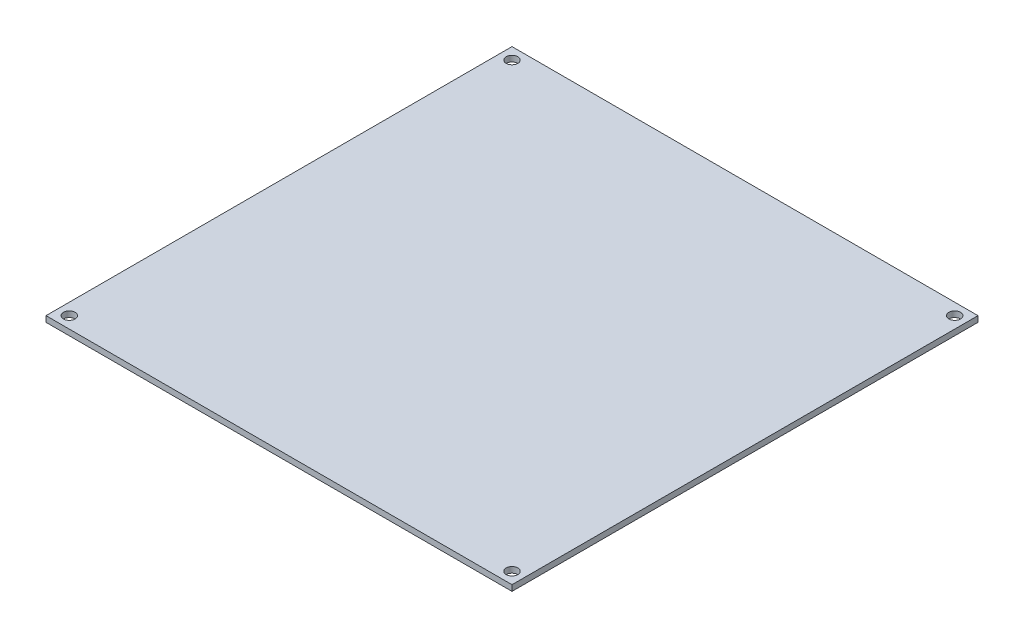
ISO-10303-21;
HEADER;
FILE_DESCRIPTION(('STEP AP214'),'2;1');
FILE_NAME('part.step','',(''),(''),'','','');
FILE_SCHEMA(('AUTOMOTIVE_DESIGN { 1 0 10303 214 1 1 1 1 }'));
ENDSEC;
DATA;
#1=APPLICATION_CONTEXT('core data for automotive mechanical design processes');
#2=APPLICATION_PROTOCOL_DEFINITION('international standard','automotive_design',2000,#1);
#3=PRODUCT_CONTEXT('',#1,'mechanical');
#4=PRODUCT('Part','Part','',(#3));
#5=PRODUCT_RELATED_PRODUCT_CATEGORY('part','',(#4));
#6=PRODUCT_DEFINITION_FORMATION('','',#4);
#7=PRODUCT_DEFINITION_CONTEXT('part definition',#1,'design');
#8=PRODUCT_DEFINITION('design','',#6,#7);
#9=PRODUCT_DEFINITION_SHAPE('','',#8);
#10=(LENGTH_UNIT() NAMED_UNIT(*) SI_UNIT(.MILLI.,.METRE.));
#11=(NAMED_UNIT(*) PLANE_ANGLE_UNIT() SI_UNIT($,.RADIAN.));
#12=(NAMED_UNIT(*) SI_UNIT($,.STERADIAN.) SOLID_ANGLE_UNIT());
#13=UNCERTAINTY_MEASURE_WITH_UNIT(LENGTH_MEASURE(1.E-05),#10,'distance_accuracy_value','');
#14=(GEOMETRIC_REPRESENTATION_CONTEXT(3) GLOBAL_UNCERTAINTY_ASSIGNED_CONTEXT((#13)) GLOBAL_UNIT_ASSIGNED_CONTEXT((#10,
#11,#12)) REPRESENTATION_CONTEXT('',''));
#15=CARTESIAN_POINT('',(0.,0.,0.));
#16=DIRECTION('',(0.,0.,1.));
#17=DIRECTION('',(1.,0.,0.));
#18=AXIS2_PLACEMENT_3D('',#15,#16,#17);
#19=CARTESIAN_POINT('',(0.,1.5875,0.));
#20=DIRECTION('',(0.,-1.,0.));
#21=DIRECTION('',(0.,0.,-1.));
#22=AXIS2_PLACEMENT_3D('',#19,#20,#21);
#23=PLANE('',#22);
#24=DIRECTION('',(0.,0.,1.));
#25=VECTOR('',#24,1.);
#26=CARTESIAN_POINT('',(0.,1.5875,0.));
#27=LINE('',#26,#25);
#28=CARTESIAN_POINT('',(0.,1.5875,-127.));
#29=VERTEX_POINT('',#28);
#30=CARTESIAN_POINT('',(0.,1.5875,0.));
#31=VERTEX_POINT('',#30);
#32=EDGE_CURVE('E91',#29,#31,#27,.T.);
#33=ORIENTED_EDGE('',*,*,#32,.T.);
#34=DIRECTION('',(1.,0.,0.));
#35=VECTOR('',#34,1.);
#36=CARTESIAN_POINT('',(0.,1.5875,0.));
#37=LINE('',#36,#35);
#38=CARTESIAN_POINT('',(127.,1.5875,0.));
#39=VERTEX_POINT('',#38);
#40=EDGE_CURVE('E86',#31,#39,#37,.T.);
#41=ORIENTED_EDGE('',*,*,#40,.T.);
#42=DIRECTION('',(0.,0.,-1.));
#43=VECTOR('',#42,1.);
#44=CARTESIAN_POINT('',(127.,1.5875,0.));
#45=LINE('',#44,#43);
#46=CARTESIAN_POINT('',(127.,1.5875,-127.));
#47=VERTEX_POINT('',#46);
#48=EDGE_CURVE('E87',#39,#47,#45,.T.);
#49=ORIENTED_EDGE('',*,*,#48,.T.);
#50=DIRECTION('',(-1.,0.,0.));
#51=VECTOR('',#50,1.);
#52=CARTESIAN_POINT('',(0.,1.5875,-127.));
#53=LINE('',#52,#51);
#54=EDGE_CURVE('E57',#47,#29,#53,.T.);
#55=ORIENTED_EDGE('',*,*,#54,.T.);
#56=EDGE_LOOP('',(#33,#41,#49,#55));
#57=FACE_BOUND('',#56,.T.);
#58=CARTESIAN_POINT('',(3.175,1.5875,-123.825));
#59=DIRECTION('',(0.,1.,0.));
#60=DIRECTION('',(0.,0.,1.));
#61=AXIS2_PLACEMENT_3D('',#58,#59,#60);
#62=CIRCLE('',#61,1.5875);
#63=CARTESIAN_POINT('',(3.175,1.5875,-122.2375));
#64=VERTEX_POINT('',#63);
#65=EDGE_CURVE('E106',#64,#64,#62,.T.);
#66=ORIENTED_EDGE('',*,*,#65,.F.);
#67=EDGE_LOOP('',(#66));
#68=FACE_BOUND('',#67,.T.);
#69=CARTESIAN_POINT('',(123.825,1.5875,-123.825));
#70=DIRECTION('',(0.,1.,0.));
#71=DIRECTION('',(0.,0.,1.));
#72=AXIS2_PLACEMENT_3D('',#69,#70,#71);
#73=CIRCLE('',#72,1.5875);
#74=CARTESIAN_POINT('',(123.825,1.5875,-122.2375));
#75=VERTEX_POINT('',#74);
#76=EDGE_CURVE('E123',#75,#75,#73,.T.);
#77=ORIENTED_EDGE('',*,*,#76,.F.);
#78=EDGE_LOOP('',(#77));
#79=FACE_BOUND('',#78,.T.);
#80=CARTESIAN_POINT('',(123.825,1.5875,-3.175));
#81=DIRECTION('',(0.,1.,0.));
#82=DIRECTION('',(0.,0.,1.));
#83=AXIS2_PLACEMENT_3D('',#80,#81,#82);
#84=CIRCLE('',#83,1.5875);
#85=CARTESIAN_POINT('',(123.825,1.5875,-1.5875));
#86=VERTEX_POINT('',#85);
#87=EDGE_CURVE('E130',#86,#86,#84,.T.);
#88=ORIENTED_EDGE('',*,*,#87,.F.);
#89=EDGE_LOOP('',(#88));
#90=FACE_BOUND('',#89,.T.);
#91=CARTESIAN_POINT('',(3.175,1.5875,-3.175));
#92=DIRECTION('',(0.,1.,0.));
#93=DIRECTION('',(0.,0.,1.));
#94=AXIS2_PLACEMENT_3D('',#91,#92,#93);
#95=CIRCLE('',#94,1.5875);
#96=CARTESIAN_POINT('',(3.175,1.5875,-1.5875));
#97=VERTEX_POINT('',#96);
#98=EDGE_CURVE('E133',#97,#97,#95,.T.);
#99=ORIENTED_EDGE('',*,*,#98,.F.);
#100=EDGE_LOOP('',(#99));
#101=FACE_BOUND('',#100,.T.);
#102=ADVANCED_FACE('F39',(#57,#68,#79,#90,#101),#23,.F.);
#103=CARTESIAN_POINT('',(0.,0.,0.));
#104=DIRECTION('',(0.,-1.,0.));
#105=DIRECTION('',(0.,0.,-1.));
#106=AXIS2_PLACEMENT_3D('',#103,#104,#105);
#107=PLANE('',#106);
#108=CARTESIAN_POINT('',(123.825,0.,-3.175));
#109=DIRECTION('',(0.,1.,0.));
#110=DIRECTION('',(0.,0.,1.));
#111=AXIS2_PLACEMENT_3D('',#108,#109,#110);
#112=CIRCLE('',#111,1.5875);
#113=CARTESIAN_POINT('',(123.825,0.,-1.5875));
#114=VERTEX_POINT('',#113);
#115=EDGE_CURVE('E127',#114,#114,#112,.T.);
#116=ORIENTED_EDGE('',*,*,#115,.T.);
#117=EDGE_LOOP('',(#116));
#118=FACE_BOUND('',#117,.T.);
#119=CARTESIAN_POINT('',(3.175,0.,-123.825));
#120=DIRECTION('',(0.,1.,0.));
#121=DIRECTION('',(0.,0.,1.));
#122=AXIS2_PLACEMENT_3D('',#119,#120,#121);
#123=CIRCLE('',#122,1.5875);
#124=CARTESIAN_POINT('',(3.175,0.,-122.2375));
#125=VERTEX_POINT('',#124);
#126=EDGE_CURVE('E119',#125,#125,#123,.T.);
#127=ORIENTED_EDGE('',*,*,#126,.T.);
#128=EDGE_LOOP('',(#127));
#129=FACE_BOUND('',#128,.T.);
#130=DIRECTION('',(0.,0.,1.));
#131=VECTOR('',#130,1.);
#132=CARTESIAN_POINT('',(0.,0.,0.));
#133=LINE('',#132,#131);
#134=CARTESIAN_POINT('',(0.,0.,-127.));
#135=VERTEX_POINT('',#134);
#136=CARTESIAN_POINT('',(0.,0.,0.));
#137=VERTEX_POINT('',#136);
#138=EDGE_CURVE('E104',#135,#137,#133,.T.);
#139=ORIENTED_EDGE('',*,*,#138,.F.);
#140=DIRECTION('',(-1.,0.,0.));
#141=VECTOR('',#140,1.);
#142=CARTESIAN_POINT('',(0.,0.,-127.));
#143=LINE('',#142,#141);
#144=CARTESIAN_POINT('',(127.,0.,-127.));
#145=VERTEX_POINT('',#144);
#146=EDGE_CURVE('E80',#145,#135,#143,.T.);
#147=ORIENTED_EDGE('',*,*,#146,.F.);
#148=DIRECTION('',(0.,0.,-1.));
#149=VECTOR('',#148,1.);
#150=CARTESIAN_POINT('',(127.,0.,0.));
#151=LINE('',#150,#149);
#152=CARTESIAN_POINT('',(127.,0.,0.));
#153=VERTEX_POINT('',#152);
#154=EDGE_CURVE('E74',#153,#145,#151,.T.);
#155=ORIENTED_EDGE('',*,*,#154,.F.);
#156=DIRECTION('',(1.,0.,0.));
#157=VECTOR('',#156,1.);
#158=CARTESIAN_POINT('',(0.,0.,0.));
#159=LINE('',#158,#157);
#160=EDGE_CURVE('E94',#137,#153,#159,.T.);
#161=ORIENTED_EDGE('',*,*,#160,.F.);
#162=EDGE_LOOP('',(#139,#147,#155,#161));
#163=FACE_BOUND('',#162,.T.);
#164=CARTESIAN_POINT('',(123.825,0.,-123.825));
#165=DIRECTION('',(0.,1.,0.));
#166=DIRECTION('',(0.,0.,1.));
#167=AXIS2_PLACEMENT_3D('',#164,#165,#166);
#168=CIRCLE('',#167,1.5875);
#169=CARTESIAN_POINT('',(123.825,0.,-122.2375));
#170=VERTEX_POINT('',#169);
#171=EDGE_CURVE('E125',#170,#170,#168,.T.);
#172=ORIENTED_EDGE('',*,*,#171,.T.);
#173=EDGE_LOOP('',(#172));
#174=FACE_BOUND('',#173,.T.);
#175=CARTESIAN_POINT('',(3.175,0.,-3.175));
#176=DIRECTION('',(0.,1.,0.));
#177=DIRECTION('',(0.,0.,1.));
#178=AXIS2_PLACEMENT_3D('',#175,#176,#177);
#179=CIRCLE('',#178,1.5875);
#180=CARTESIAN_POINT('',(3.175,0.,-1.5875));
#181=VERTEX_POINT('',#180);
#182=EDGE_CURVE('E136',#181,#181,#179,.T.);
#183=ORIENTED_EDGE('',*,*,#182,.T.);
#184=EDGE_LOOP('',(#183));
#185=FACE_BOUND('',#184,.T.);
#186=ADVANCED_FACE('F114',(#118,#129,#163,#174,#185),#107,.T.);
#187=CARTESIAN_POINT('',(0.,1.5875,0.));
#188=DIRECTION('',(1.,0.,0.));
#189=DIRECTION('',(0.,0.,-1.));
#190=AXIS2_PLACEMENT_3D('',#187,#188,#189);
#191=PLANE('',#190);
#192=ORIENTED_EDGE('',*,*,#138,.T.);
#193=DIRECTION('',(0.,-1.,0.));
#194=VECTOR('',#193,1.);
#195=CARTESIAN_POINT('',(0.,1.5875,0.));
#196=LINE('',#195,#194);
#197=EDGE_CURVE('E11',#31,#137,#196,.T.);
#198=ORIENTED_EDGE('',*,*,#197,.F.);
#199=ORIENTED_EDGE('',*,*,#32,.F.);
#200=DIRECTION('',(0.,-1.,0.));
#201=VECTOR('',#200,1.);
#202=CARTESIAN_POINT('',(0.,1.5875,-127.));
#203=LINE('',#202,#201);
#204=EDGE_CURVE('E98',#29,#135,#203,.T.);
#205=ORIENTED_EDGE('',*,*,#204,.T.);
#206=EDGE_LOOP('',(#192,#198,#199,#205));
#207=FACE_BOUND('',#206,.T.);
#208=ADVANCED_FACE('F41',(#207),#191,.F.);
#209=CARTESIAN_POINT('',(0.,1.5875,0.));
#210=DIRECTION('',(0.,0.,-1.));
#211=DIRECTION('',(-1.,0.,0.));
#212=AXIS2_PLACEMENT_3D('',#209,#210,#211);
#213=PLANE('',#212);
#214=ORIENTED_EDGE('',*,*,#160,.T.);
#215=DIRECTION('',(0.,-1.,0.));
#216=VECTOR('',#215,1.);
#217=CARTESIAN_POINT('',(127.,1.5875,0.));
#218=LINE('',#217,#216);
#219=EDGE_CURVE('E48',#39,#153,#218,.T.);
#220=ORIENTED_EDGE('',*,*,#219,.F.);
#221=ORIENTED_EDGE('',*,*,#40,.F.);
#222=ORIENTED_EDGE('',*,*,#197,.T.);
#223=EDGE_LOOP('',(#214,#220,#221,#222));
#224=FACE_BOUND('',#223,.T.);
#225=ADVANCED_FACE('F92',(#224),#213,.F.);
#226=CARTESIAN_POINT('',(127.,1.5875,0.));
#227=DIRECTION('',(-1.,0.,0.));
#228=DIRECTION('',(0.,0.,1.));
#229=AXIS2_PLACEMENT_3D('',#226,#227,#228);
#230=PLANE('',#229);
#231=ORIENTED_EDGE('',*,*,#154,.T.);
#232=DIRECTION('',(0.,-1.,0.));
#233=VECTOR('',#232,1.);
#234=CARTESIAN_POINT('',(127.,1.5875,-127.));
#235=LINE('',#234,#233);
#236=EDGE_CURVE('E96',#47,#145,#235,.T.);
#237=ORIENTED_EDGE('',*,*,#236,.F.);
#238=ORIENTED_EDGE('',*,*,#48,.F.);
#239=ORIENTED_EDGE('',*,*,#219,.T.);
#240=EDGE_LOOP('',(#231,#237,#238,#239));
#241=FACE_BOUND('',#240,.T.);
#242=ADVANCED_FACE('F100',(#241),#230,.F.);
#243=CARTESIAN_POINT('',(0.,1.5875,-127.));
#244=DIRECTION('',(0.,0.,1.));
#245=DIRECTION('',(1.,0.,0.));
#246=AXIS2_PLACEMENT_3D('',#243,#244,#245);
#247=PLANE('',#246);
#248=ORIENTED_EDGE('',*,*,#146,.T.);
#249=ORIENTED_EDGE('',*,*,#204,.F.);
#250=ORIENTED_EDGE('',*,*,#54,.F.);
#251=ORIENTED_EDGE('',*,*,#236,.T.);
#252=EDGE_LOOP('',(#248,#249,#250,#251));
#253=FACE_BOUND('',#252,.T.);
#254=ADVANCED_FACE('F112',(#253),#247,.F.);
#255=CARTESIAN_POINT('',(3.175,1.5875,-123.825));
#256=DIRECTION('',(0.,-1.,0.));
#257=DIRECTION('',(0.,0.,-1.));
#258=AXIS2_PLACEMENT_3D('',#255,#256,#257);
#259=CYLINDRICAL_SURFACE('',#258,1.5875);
#260=ORIENTED_EDGE('',*,*,#65,.T.);
#261=EDGE_LOOP('',(#260));
#262=FACE_BOUND('',#261,.T.);
#263=ORIENTED_EDGE('',*,*,#126,.F.);
#264=EDGE_LOOP('',(#263));
#265=FACE_BOUND('',#264,.T.);
#266=ADVANCED_FACE('F154',(#262,#265),#259,.F.);
#267=CARTESIAN_POINT('',(123.825,1.5875,-123.825));
#268=DIRECTION('',(0.,-1.,0.));
#269=DIRECTION('',(0.,0.,-1.));
#270=AXIS2_PLACEMENT_3D('',#267,#268,#269);
#271=CYLINDRICAL_SURFACE('',#270,1.5875);
#272=ORIENTED_EDGE('',*,*,#76,.T.);
#273=EDGE_LOOP('',(#272));
#274=FACE_BOUND('',#273,.T.);
#275=ORIENTED_EDGE('',*,*,#171,.F.);
#276=EDGE_LOOP('',(#275));
#277=FACE_BOUND('',#276,.T.);
#278=ADVANCED_FACE('F199',(#274,#277),#271,.F.);
#279=CARTESIAN_POINT('',(123.825,1.5875,-3.175));
#280=DIRECTION('',(0.,-1.,0.));
#281=DIRECTION('',(0.,0.,-1.));
#282=AXIS2_PLACEMENT_3D('',#279,#280,#281);
#283=CYLINDRICAL_SURFACE('',#282,1.5875);
#284=ORIENTED_EDGE('',*,*,#87,.T.);
#285=EDGE_LOOP('',(#284));
#286=FACE_BOUND('',#285,.T.);
#287=ORIENTED_EDGE('',*,*,#115,.F.);
#288=EDGE_LOOP('',(#287));
#289=FACE_BOUND('',#288,.T.);
#290=ADVANCED_FACE('F206',(#286,#289),#283,.F.);
#291=CARTESIAN_POINT('',(3.175,1.5875,-3.175));
#292=DIRECTION('',(0.,-1.,0.));
#293=DIRECTION('',(0.,0.,-1.));
#294=AXIS2_PLACEMENT_3D('',#291,#292,#293);
#295=CYLINDRICAL_SURFACE('',#294,1.5875);
#296=ORIENTED_EDGE('',*,*,#98,.T.);
#297=EDGE_LOOP('',(#296));
#298=FACE_BOUND('',#297,.T.);
#299=ORIENTED_EDGE('',*,*,#182,.F.);
#300=EDGE_LOOP('',(#299));
#301=FACE_BOUND('',#300,.T.);
#302=ADVANCED_FACE('F145',(#298,#301),#295,.F.);
#303=CLOSED_SHELL('',(#102,#186,#208,#225,#242,#254,#266,#278,#290,#302));
#304=MANIFOLD_SOLID_BREP('B2',#303);
#305=ADVANCED_BREP_SHAPE_REPRESENTATION('',(#18,#304),#14);
#306=SHAPE_DEFINITION_REPRESENTATION(#9,#305);
ENDSEC;
END-ISO-10303-21;
